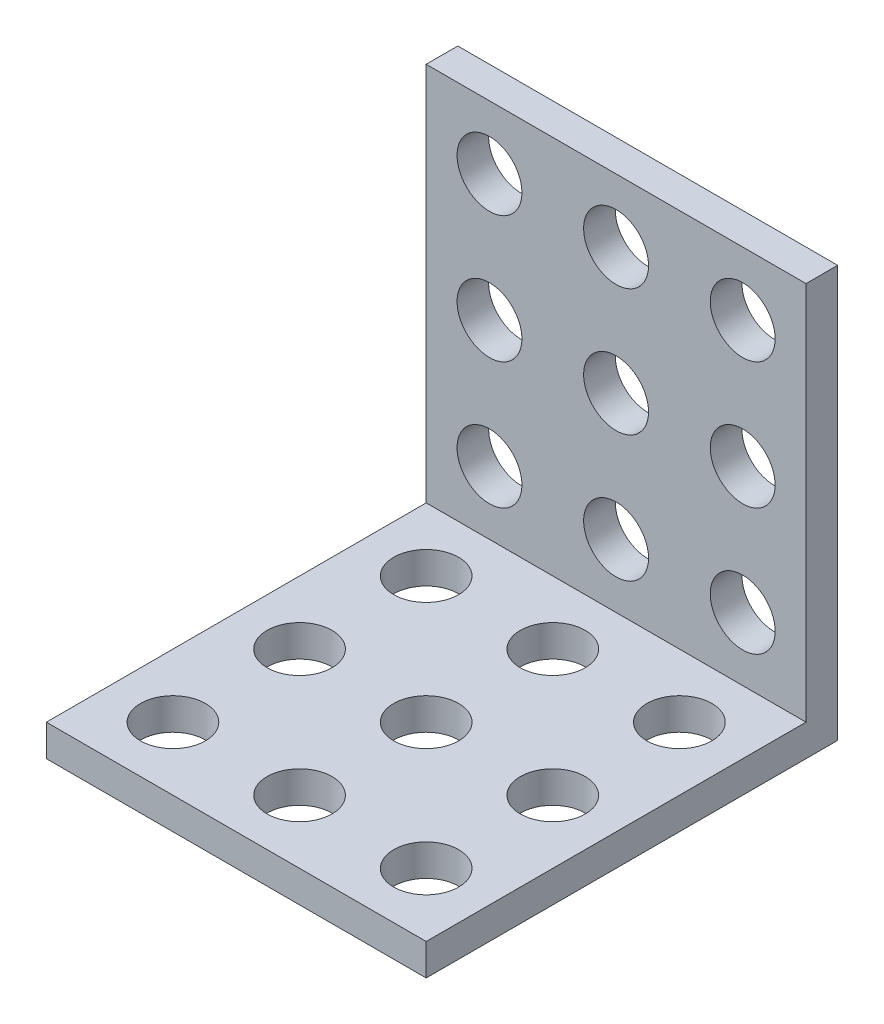
ISO-10303-21;
HEADER;
FILE_DESCRIPTION(('STEP AP214'),'2;1');
FILE_NAME('part.step','',(''),(''),'','','');
FILE_SCHEMA(('AUTOMOTIVE_DESIGN { 1 0 10303 214 1 1 1 1 }'));
ENDSEC;
DATA;
#1=APPLICATION_CONTEXT('core data for automotive mechanical design processes');
#2=APPLICATION_PROTOCOL_DEFINITION('international standard','automotive_design',2000,#1);
#3=PRODUCT_CONTEXT('',#1,'mechanical');
#4=PRODUCT('Part','Part','',(#3));
#5=PRODUCT_RELATED_PRODUCT_CATEGORY('part','',(#4));
#6=PRODUCT_DEFINITION_FORMATION('','',#4);
#7=PRODUCT_DEFINITION_CONTEXT('part definition',#1,'design');
#8=PRODUCT_DEFINITION('design','',#6,#7);
#9=PRODUCT_DEFINITION_SHAPE('','',#8);
#10=(LENGTH_UNIT() NAMED_UNIT(*) SI_UNIT(.MILLI.,.METRE.));
#11=(NAMED_UNIT(*) PLANE_ANGLE_UNIT() SI_UNIT($,.RADIAN.));
#12=(NAMED_UNIT(*) SI_UNIT($,.STERADIAN.) SOLID_ANGLE_UNIT());
#13=UNCERTAINTY_MEASURE_WITH_UNIT(LENGTH_MEASURE(1.E-05),#10,'distance_accuracy_value','');
#14=(GEOMETRIC_REPRESENTATION_CONTEXT(3) GLOBAL_UNCERTAINTY_ASSIGNED_CONTEXT((#13)) GLOBAL_UNIT_ASSIGNED_CONTEXT((#10,
#11,#12)) REPRESENTATION_CONTEXT('',''));
#15=CARTESIAN_POINT('',(0.,0.,0.));
#16=DIRECTION('',(0.,0.,1.));
#17=DIRECTION('',(1.,0.,0.));
#18=AXIS2_PLACEMENT_3D('',#15,#16,#17);
#19=CARTESIAN_POINT('',(24.,2.,26.));
#20=DIRECTION('',(0.,-1.,0.));
#21=DIRECTION('',(0.,0.,-1.));
#22=AXIS2_PLACEMENT_3D('',#19,#20,#21);
#23=PLANE('',#22);
#24=CARTESIAN_POINT('',(20.,1.99999999999999,6.));
#25=DIRECTION('',(0.,1.,0.));
#26=DIRECTION('',(0.,0.,1.));
#27=AXIS2_PLACEMENT_3D('',#24,#25,#26);
#28=CIRCLE('',#27,2.04999999999999);
#29=CARTESIAN_POINT('',(20.,1.99999999999999,8.04999999999999));
#30=VERTEX_POINT('',#29);
#31=EDGE_CURVE('E265',#30,#30,#28,.T.);
#32=ORIENTED_EDGE('',*,*,#31,.F.);
#33=EDGE_LOOP('',(#32));
#34=FACE_BOUND('',#33,.T.);
#35=CARTESIAN_POINT('',(20.,1.99999999999998,22.));
#36=DIRECTION('',(0.,1.,0.));
#37=DIRECTION('',(0.,0.,1.));
#38=AXIS2_PLACEMENT_3D('',#35,#36,#37);
#39=CIRCLE('',#38,2.04999999999999);
#40=CARTESIAN_POINT('',(20.,1.99999999999997,24.05));
#41=VERTEX_POINT('',#40);
#42=EDGE_CURVE('E275',#41,#41,#39,.T.);
#43=ORIENTED_EDGE('',*,*,#42,.F.);
#44=EDGE_LOOP('',(#43));
#45=FACE_BOUND('',#44,.T.);
#46=CARTESIAN_POINT('',(12.,1.99999999999999,14.));
#47=DIRECTION('',(0.,1.,0.));
#48=DIRECTION('',(0.,0.,1.));
#49=AXIS2_PLACEMENT_3D('',#46,#47,#48);
#50=CIRCLE('',#49,2.04999999999999);
#51=CARTESIAN_POINT('',(12.,1.99999999999998,16.05));
#52=VERTEX_POINT('',#51);
#53=EDGE_CURVE('E287',#52,#52,#50,.T.);
#54=ORIENTED_EDGE('',*,*,#53,.F.);
#55=EDGE_LOOP('',(#54));
#56=FACE_BOUND('',#55,.T.);
#57=CARTESIAN_POINT('',(12.,1.99999999999998,22.));
#58=DIRECTION('',(0.,1.,0.));
#59=DIRECTION('',(0.,0.,1.));
#60=AXIS2_PLACEMENT_3D('',#57,#58,#59);
#61=CIRCLE('',#60,2.04999999999999);
#62=CARTESIAN_POINT('',(12.,1.99999999999997,24.05));
#63=VERTEX_POINT('',#62);
#64=EDGE_CURVE('E293',#63,#63,#61,.T.);
#65=ORIENTED_EDGE('',*,*,#64,.F.);
#66=EDGE_LOOP('',(#65));
#67=FACE_BOUND('',#66,.T.);
#68=CARTESIAN_POINT('',(4.,1.99999999999999,6.));
#69=DIRECTION('',(0.,1.,0.));
#70=DIRECTION('',(0.,0.,1.));
#71=AXIS2_PLACEMENT_3D('',#68,#69,#70);
#72=CIRCLE('',#71,2.04999999999999);
#73=CARTESIAN_POINT('',(4.,1.99999999999999,8.04999999999999));
#74=VERTEX_POINT('',#73);
#75=EDGE_CURVE('E299',#74,#74,#72,.T.);
#76=ORIENTED_EDGE('',*,*,#75,.F.);
#77=EDGE_LOOP('',(#76));
#78=FACE_BOUND('',#77,.T.);
#79=CARTESIAN_POINT('',(4.,1.99999999999999,14.));
#80=DIRECTION('',(0.,1.,0.));
#81=DIRECTION('',(0.,0.,1.));
#82=AXIS2_PLACEMENT_3D('',#79,#80,#81);
#83=CIRCLE('',#82,2.04999999999999);
#84=CARTESIAN_POINT('',(4.,1.99999999999998,16.05));
#85=VERTEX_POINT('',#84);
#86=EDGE_CURVE('E305',#85,#85,#83,.T.);
#87=ORIENTED_EDGE('',*,*,#86,.F.);
#88=EDGE_LOOP('',(#87));
#89=FACE_BOUND('',#88,.T.);
#90=CARTESIAN_POINT('',(4.,1.99999999999998,22.));
#91=DIRECTION('',(0.,1.,0.));
#92=DIRECTION('',(0.,0.,1.));
#93=AXIS2_PLACEMENT_3D('',#90,#91,#92);
#94=CIRCLE('',#93,2.04999999999999);
#95=CARTESIAN_POINT('',(4.,1.99999999999997,24.05));
#96=VERTEX_POINT('',#95);
#97=EDGE_CURVE('E311',#96,#96,#94,.T.);
#98=ORIENTED_EDGE('',*,*,#97,.F.);
#99=EDGE_LOOP('',(#98));
#100=FACE_BOUND('',#99,.T.);
#101=DIRECTION('',(0.,0.,1.));
#102=VECTOR('',#101,1.);
#103=CARTESIAN_POINT('',(0.,2.,26.));
#104=LINE('',#103,#102);
#105=CARTESIAN_POINT('',(0.,2.,2.));
#106=VERTEX_POINT('',#105);
#107=CARTESIAN_POINT('',(0.,2.,26.));
#108=VERTEX_POINT('',#107);
#109=EDGE_CURVE('E72',#106,#108,#104,.T.);
#110=ORIENTED_EDGE('',*,*,#109,.T.);
#111=DIRECTION('',(-1.,0.,0.));
#112=VECTOR('',#111,1.);
#113=CARTESIAN_POINT('',(24.,2.,26.));
#114=LINE('',#113,#112);
#115=CARTESIAN_POINT('',(24.,2.,26.));
#116=VERTEX_POINT('',#115);
#117=EDGE_CURVE('E111',#116,#108,#114,.T.);
#118=ORIENTED_EDGE('',*,*,#117,.F.);
#119=DIRECTION('',(0.,0.,1.));
#120=VECTOR('',#119,1.);
#121=CARTESIAN_POINT('',(24.,2.,26.));
#122=LINE('',#121,#120);
#123=CARTESIAN_POINT('',(24.,2.,2.));
#124=VERTEX_POINT('',#123);
#125=EDGE_CURVE('E98',#124,#116,#122,.T.);
#126=ORIENTED_EDGE('',*,*,#125,.F.);
#127=DIRECTION('',(-1.,0.,0.));
#128=VECTOR('',#127,1.);
#129=CARTESIAN_POINT('',(24.,2.,2.));
#130=LINE('',#129,#128);
#131=EDGE_CURVE('E105',#124,#106,#130,.T.);
#132=ORIENTED_EDGE('',*,*,#131,.T.);
#133=EDGE_LOOP('',(#110,#118,#126,#132));
#134=FACE_BOUND('',#133,.T.);
#135=CARTESIAN_POINT('',(12.,1.99999999999999,6.));
#136=DIRECTION('',(0.,1.,0.));
#137=DIRECTION('',(0.,0.,1.));
#138=AXIS2_PLACEMENT_3D('',#135,#136,#137);
#139=CIRCLE('',#138,2.04999999999999);
#140=CARTESIAN_POINT('',(12.,1.99999999999999,8.04999999999999));
#141=VERTEX_POINT('',#140);
#142=EDGE_CURVE('E281',#141,#141,#139,.T.);
#143=ORIENTED_EDGE('',*,*,#142,.F.);
#144=EDGE_LOOP('',(#143));
#145=FACE_BOUND('',#144,.T.);
#146=CARTESIAN_POINT('',(20.,1.99999999999999,14.));
#147=DIRECTION('',(0.,1.,0.));
#148=DIRECTION('',(0.,0.,1.));
#149=AXIS2_PLACEMENT_3D('',#146,#147,#148);
#150=CIRCLE('',#149,2.04999999999999);
#151=CARTESIAN_POINT('',(20.,1.99999999999998,16.05));
#152=VERTEX_POINT('',#151);
#153=EDGE_CURVE('E267',#152,#152,#150,.T.);
#154=ORIENTED_EDGE('',*,*,#153,.F.);
#155=EDGE_LOOP('',(#154));
#156=FACE_BOUND('',#155,.T.);
#157=ADVANCED_FACE('F32',(#34,#45,#56,#67,#78,#89,#100,#134,#145,#156),#23,.F.);
#158=CARTESIAN_POINT('',(24.,0.,0.));
#159=DIRECTION('',(0.,1.,0.));
#160=DIRECTION('',(0.,0.,1.));
#161=AXIS2_PLACEMENT_3D('',#158,#159,#160);
#162=PLANE('',#161);
#163=CARTESIAN_POINT('',(20.,0.,6.));
#164=DIRECTION('',(0.,1.,0.));
#165=DIRECTION('',(0.,0.,1.));
#166=AXIS2_PLACEMENT_3D('',#163,#164,#165);
#167=CIRCLE('',#166,2.04999999999999);
#168=CARTESIAN_POINT('',(20.,0.,8.04999999999999));
#169=VERTEX_POINT('',#168);
#170=EDGE_CURVE('E263',#169,#169,#167,.T.);
#171=ORIENTED_EDGE('',*,*,#170,.T.);
#172=EDGE_LOOP('',(#171));
#173=FACE_BOUND('',#172,.T.);
#174=CARTESIAN_POINT('',(20.,0.,14.));
#175=DIRECTION('',(0.,1.,0.));
#176=DIRECTION('',(0.,0.,1.));
#177=AXIS2_PLACEMENT_3D('',#174,#175,#176);
#178=CIRCLE('',#177,2.04999999999999);
#179=CARTESIAN_POINT('',(20.,0.,16.05));
#180=VERTEX_POINT('',#179);
#181=EDGE_CURVE('E272',#180,#180,#178,.T.);
#182=ORIENTED_EDGE('',*,*,#181,.T.);
#183=EDGE_LOOP('',(#182));
#184=FACE_BOUND('',#183,.T.);
#185=CARTESIAN_POINT('',(20.,0.,22.));
#186=DIRECTION('',(0.,1.,0.));
#187=DIRECTION('',(0.,0.,1.));
#188=AXIS2_PLACEMENT_3D('',#185,#186,#187);
#189=CIRCLE('',#188,2.04999999999999);
#190=CARTESIAN_POINT('',(20.,0.,24.05));
#191=VERTEX_POINT('',#190);
#192=EDGE_CURVE('E278',#191,#191,#189,.T.);
#193=ORIENTED_EDGE('',*,*,#192,.T.);
#194=EDGE_LOOP('',(#193));
#195=FACE_BOUND('',#194,.T.);
#196=CARTESIAN_POINT('',(12.,0.,6.));
#197=DIRECTION('',(0.,1.,0.));
#198=DIRECTION('',(0.,0.,1.));
#199=AXIS2_PLACEMENT_3D('',#196,#197,#198);
#200=CIRCLE('',#199,2.04999999999999);
#201=CARTESIAN_POINT('',(12.,0.,8.04999999999999));
#202=VERTEX_POINT('',#201);
#203=EDGE_CURVE('E284',#202,#202,#200,.T.);
#204=ORIENTED_EDGE('',*,*,#203,.T.);
#205=EDGE_LOOP('',(#204));
#206=FACE_BOUND('',#205,.T.);
#207=CARTESIAN_POINT('',(12.,0.,14.));
#208=DIRECTION('',(0.,1.,0.));
#209=DIRECTION('',(0.,0.,1.));
#210=AXIS2_PLACEMENT_3D('',#207,#208,#209);
#211=CIRCLE('',#210,2.04999999999999);
#212=CARTESIAN_POINT('',(12.,0.,16.05));
#213=VERTEX_POINT('',#212);
#214=EDGE_CURVE('E290',#213,#213,#211,.T.);
#215=ORIENTED_EDGE('',*,*,#214,.T.);
#216=EDGE_LOOP('',(#215));
#217=FACE_BOUND('',#216,.T.);
#218=CARTESIAN_POINT('',(12.,0.,22.));
#219=DIRECTION('',(0.,1.,0.));
#220=DIRECTION('',(0.,0.,1.));
#221=AXIS2_PLACEMENT_3D('',#218,#219,#220);
#222=CIRCLE('',#221,2.04999999999999);
#223=CARTESIAN_POINT('',(12.,0.,24.05));
#224=VERTEX_POINT('',#223);
#225=EDGE_CURVE('E296',#224,#224,#222,.T.);
#226=ORIENTED_EDGE('',*,*,#225,.T.);
#227=EDGE_LOOP('',(#226));
#228=FACE_BOUND('',#227,.T.);
#229=CARTESIAN_POINT('',(4.,0.,6.));
#230=DIRECTION('',(0.,1.,0.));
#231=DIRECTION('',(0.,0.,1.));
#232=AXIS2_PLACEMENT_3D('',#229,#230,#231);
#233=CIRCLE('',#232,2.04999999999999);
#234=CARTESIAN_POINT('',(4.,0.,8.04999999999999));
#235=VERTEX_POINT('',#234);
#236=EDGE_CURVE('E302',#235,#235,#233,.T.);
#237=ORIENTED_EDGE('',*,*,#236,.T.);
#238=EDGE_LOOP('',(#237));
#239=FACE_BOUND('',#238,.T.);
#240=CARTESIAN_POINT('',(4.,0.,14.));
#241=DIRECTION('',(0.,1.,0.));
#242=DIRECTION('',(0.,0.,1.));
#243=AXIS2_PLACEMENT_3D('',#240,#241,#242);
#244=CIRCLE('',#243,2.04999999999999);
#245=CARTESIAN_POINT('',(4.,0.,16.05));
#246=VERTEX_POINT('',#245);
#247=EDGE_CURVE('E308',#246,#246,#244,.T.);
#248=ORIENTED_EDGE('',*,*,#247,.T.);
#249=EDGE_LOOP('',(#248));
#250=FACE_BOUND('',#249,.T.);
#251=CARTESIAN_POINT('',(4.,0.,22.));
#252=DIRECTION('',(0.,1.,0.));
#253=DIRECTION('',(0.,0.,1.));
#254=AXIS2_PLACEMENT_3D('',#251,#252,#253);
#255=CIRCLE('',#254,2.04999999999999);
#256=CARTESIAN_POINT('',(4.,0.,24.05));
#257=VERTEX_POINT('',#256);
#258=EDGE_CURVE('E314',#257,#257,#255,.T.);
#259=ORIENTED_EDGE('',*,*,#258,.T.);
#260=EDGE_LOOP('',(#259));
#261=FACE_BOUND('',#260,.T.);
#262=DIRECTION('',(0.,0.,-1.));
#263=VECTOR('',#262,1.);
#264=CARTESIAN_POINT('',(0.,0.,0.));
#265=LINE('',#264,#263);
#266=CARTESIAN_POINT('',(0.,0.,26.));
#267=VERTEX_POINT('',#266);
#268=CARTESIAN_POINT('',(0.,0.,0.));
#269=VERTEX_POINT('',#268);
#270=EDGE_CURVE('E119',#267,#269,#265,.T.);
#271=ORIENTED_EDGE('',*,*,#270,.T.);
#272=DIRECTION('',(-1.,0.,0.));
#273=VECTOR('',#272,1.);
#274=CARTESIAN_POINT('',(24.,0.,0.));
#275=LINE('',#274,#273);
#276=CARTESIAN_POINT('',(24.,0.,0.));
#277=VERTEX_POINT('',#276);
#278=EDGE_CURVE('E137',#277,#269,#275,.T.);
#279=ORIENTED_EDGE('',*,*,#278,.F.);
#280=DIRECTION('',(0.,0.,-1.));
#281=VECTOR('',#280,1.);
#282=CARTESIAN_POINT('',(24.,0.,0.));
#283=LINE('',#282,#281);
#284=CARTESIAN_POINT('',(24.,0.,26.));
#285=VERTEX_POINT('',#284);
#286=EDGE_CURVE('E130',#285,#277,#283,.T.);
#287=ORIENTED_EDGE('',*,*,#286,.F.);
#288=DIRECTION('',(-1.,0.,0.));
#289=VECTOR('',#288,1.);
#290=CARTESIAN_POINT('',(24.,0.,26.));
#291=LINE('',#290,#289);
#292=EDGE_CURVE('E115',#285,#267,#291,.T.);
#293=ORIENTED_EDGE('',*,*,#292,.T.);
#294=EDGE_LOOP('',(#271,#279,#287,#293));
#295=FACE_BOUND('',#294,.T.);
#296=ADVANCED_FACE('F195',(#173,#184,#195,#206,#217,#228,#239,#250,#261,#295),#162,.F.);
#297=CARTESIAN_POINT('',(24.,0.,0.));
#298=DIRECTION('',(0.,0.,1.));
#299=DIRECTION('',(1.,0.,0.));
#300=AXIS2_PLACEMENT_3D('',#297,#298,#299);
#301=PLANE('',#300);
#302=CARTESIAN_POINT('',(12.,22.,0.));
#303=DIRECTION('',(0.,0.,1.));
#304=DIRECTION('',(1.,0.,0.));
#305=AXIS2_PLACEMENT_3D('',#302,#303,#304);
#306=CIRCLE('',#305,2.04999999999999);
#307=CARTESIAN_POINT('',(14.05,22.,0.));
#308=VERTEX_POINT('',#307);
#309=EDGE_CURVE('E317',#308,#308,#306,.T.);
#310=ORIENTED_EDGE('',*,*,#309,.T.);
#311=EDGE_LOOP('',(#310));
#312=FACE_BOUND('',#311,.T.);
#313=CARTESIAN_POINT('',(12.,14.,0.));
#314=DIRECTION('',(0.,0.,1.));
#315=DIRECTION('',(1.,0.,0.));
#316=AXIS2_PLACEMENT_3D('',#313,#314,#315);
#317=CIRCLE('',#316,2.04999999999999);
#318=CARTESIAN_POINT('',(14.05,14.,0.));
#319=VERTEX_POINT('',#318);
#320=EDGE_CURVE('E323',#319,#319,#317,.T.);
#321=ORIENTED_EDGE('',*,*,#320,.T.);
#322=EDGE_LOOP('',(#321));
#323=FACE_BOUND('',#322,.T.);
#324=CARTESIAN_POINT('',(4.,22.,0.));
#325=DIRECTION('',(0.,0.,1.));
#326=DIRECTION('',(1.,0.,0.));
#327=AXIS2_PLACEMENT_3D('',#324,#325,#326);
#328=CIRCLE('',#327,2.04999999999999);
#329=CARTESIAN_POINT('',(6.04999999999999,22.,0.));
#330=VERTEX_POINT('',#329);
#331=EDGE_CURVE('E123',#330,#330,#328,.T.);
#332=ORIENTED_EDGE('',*,*,#331,.T.);
#333=EDGE_LOOP('',(#332));
#334=FACE_BOUND('',#333,.T.);
#335=DIRECTION('',(0.,1.,0.));
#336=VECTOR('',#335,1.);
#337=CARTESIAN_POINT('',(0.,0.,0.));
#338=LINE('',#337,#336);
#339=CARTESIAN_POINT('',(0.,26.,0.));
#340=VERTEX_POINT('',#339);
#341=EDGE_CURVE('E122',#269,#340,#338,.T.);
#342=ORIENTED_EDGE('',*,*,#341,.T.);
#343=DIRECTION('',(-1.,0.,0.));
#344=VECTOR('',#343,1.);
#345=CARTESIAN_POINT('',(24.,26.,0.));
#346=LINE('',#345,#344);
#347=CARTESIAN_POINT('',(24.,26.,0.));
#348=VERTEX_POINT('',#347);
#349=EDGE_CURVE('E134',#348,#340,#346,.T.);
#350=ORIENTED_EDGE('',*,*,#349,.F.);
#351=DIRECTION('',(0.,1.,0.));
#352=VECTOR('',#351,1.);
#353=CARTESIAN_POINT('',(24.,0.,0.));
#354=LINE('',#353,#352);
#355=EDGE_CURVE('E87',#277,#348,#354,.T.);
#356=ORIENTED_EDGE('',*,*,#355,.F.);
#357=ORIENTED_EDGE('',*,*,#278,.T.);
#358=EDGE_LOOP('',(#342,#350,#356,#357));
#359=FACE_BOUND('',#358,.T.);
#360=CARTESIAN_POINT('',(20.,22.,0.));
#361=DIRECTION('',(0.,0.,1.));
#362=DIRECTION('',(1.,0.,0.));
#363=AXIS2_PLACEMENT_3D('',#360,#361,#362);
#364=CIRCLE('',#363,2.04999999999999);
#365=CARTESIAN_POINT('',(22.05,22.,0.));
#366=VERTEX_POINT('',#365);
#367=EDGE_CURVE('E139',#366,#366,#364,.T.);
#368=ORIENTED_EDGE('',*,*,#367,.T.);
#369=EDGE_LOOP('',(#368));
#370=FACE_BOUND('',#369,.T.);
#371=CARTESIAN_POINT('',(4.,14.,0.));
#372=DIRECTION('',(0.,0.,1.));
#373=DIRECTION('',(1.,0.,0.));
#374=AXIS2_PLACEMENT_3D('',#371,#372,#373);
#375=CIRCLE('',#374,2.04999999999999);
#376=CARTESIAN_POINT('',(6.04999999999999,14.,0.));
#377=VERTEX_POINT('',#376);
#378=EDGE_CURVE('E145',#377,#377,#375,.T.);
#379=ORIENTED_EDGE('',*,*,#378,.T.);
#380=EDGE_LOOP('',(#379));
#381=FACE_BOUND('',#380,.T.);
#382=CARTESIAN_POINT('',(20.,14.,0.));
#383=DIRECTION('',(0.,0.,1.));
#384=DIRECTION('',(1.,0.,0.));
#385=AXIS2_PLACEMENT_3D('',#382,#383,#384);
#386=CIRCLE('',#385,2.04999999999999);
#387=CARTESIAN_POINT('',(22.05,14.,0.));
#388=VERTEX_POINT('',#387);
#389=EDGE_CURVE('E151',#388,#388,#386,.T.);
#390=ORIENTED_EDGE('',*,*,#389,.T.);
#391=EDGE_LOOP('',(#390));
#392=FACE_BOUND('',#391,.T.);
#393=CARTESIAN_POINT('',(4.,6.,0.));
#394=DIRECTION('',(0.,0.,1.));
#395=DIRECTION('',(1.,0.,0.));
#396=AXIS2_PLACEMENT_3D('',#393,#394,#395);
#397=CIRCLE('',#396,2.04999999999999);
#398=CARTESIAN_POINT('',(6.04999999999999,6.,0.));
#399=VERTEX_POINT('',#398);
#400=EDGE_CURVE('E157',#399,#399,#397,.T.);
#401=ORIENTED_EDGE('',*,*,#400,.T.);
#402=EDGE_LOOP('',(#401));
#403=FACE_BOUND('',#402,.T.);
#404=CARTESIAN_POINT('',(12.,6.,0.));
#405=DIRECTION('',(0.,0.,1.));
#406=DIRECTION('',(1.,0.,0.));
#407=AXIS2_PLACEMENT_3D('',#404,#405,#406);
#408=CIRCLE('',#407,2.04999999999999);
#409=CARTESIAN_POINT('',(14.05,6.,0.));
#410=VERTEX_POINT('',#409);
#411=EDGE_CURVE('E163',#410,#410,#408,.T.);
#412=ORIENTED_EDGE('',*,*,#411,.T.);
#413=EDGE_LOOP('',(#412));
#414=FACE_BOUND('',#413,.T.);
#415=CARTESIAN_POINT('',(20.,6.,0.));
#416=DIRECTION('',(0.,0.,1.));
#417=DIRECTION('',(1.,0.,0.));
#418=AXIS2_PLACEMENT_3D('',#415,#416,#417);
#419=CIRCLE('',#418,2.04999999999999);
#420=CARTESIAN_POINT('',(22.05,6.,0.));
#421=VERTEX_POINT('',#420);
#422=EDGE_CURVE('E41',#421,#421,#419,.T.);
#423=ORIENTED_EDGE('',*,*,#422,.T.);
#424=EDGE_LOOP('',(#423));
#425=FACE_BOUND('',#424,.T.);
#426=ADVANCED_FACE('F171',(#312,#323,#334,#359,#370,#381,#392,#403,#414,#425),#301,.F.);
#427=CARTESIAN_POINT('',(24.,26.,0.));
#428=DIRECTION('',(0.,-1.,0.));
#429=DIRECTION('',(0.,0.,-1.));
#430=AXIS2_PLACEMENT_3D('',#427,#428,#429);
#431=PLANE('',#430);
#432=DIRECTION('',(0.,0.,1.));
#433=VECTOR('',#432,1.);
#434=CARTESIAN_POINT('',(0.,26.,0.));
#435=LINE('',#434,#433);
#436=CARTESIAN_POINT('',(0.,26.,2.));
#437=VERTEX_POINT('',#436);
#438=EDGE_CURVE('E125',#340,#437,#435,.T.);
#439=ORIENTED_EDGE('',*,*,#438,.T.);
#440=DIRECTION('',(-1.,0.,0.));
#441=VECTOR('',#440,1.);
#442=CARTESIAN_POINT('',(24.,26.,2.));
#443=LINE('',#442,#441);
#444=CARTESIAN_POINT('',(24.,26.,2.));
#445=VERTEX_POINT('',#444);
#446=EDGE_CURVE('E110',#445,#437,#443,.T.);
#447=ORIENTED_EDGE('',*,*,#446,.F.);
#448=DIRECTION('',(0.,0.,1.));
#449=VECTOR('',#448,1.);
#450=CARTESIAN_POINT('',(24.,26.,0.));
#451=LINE('',#450,#449);
#452=EDGE_CURVE('E100',#348,#445,#451,.T.);
#453=ORIENTED_EDGE('',*,*,#452,.F.);
#454=ORIENTED_EDGE('',*,*,#349,.T.);
#455=EDGE_LOOP('',(#439,#447,#453,#454));
#456=FACE_BOUND('',#455,.T.);
#457=ADVANCED_FACE('F181',(#456),#431,.F.);
#458=CARTESIAN_POINT('',(24.,2.,2.));
#459=DIRECTION('',(0.,0.,-1.));
#460=DIRECTION('',(-1.,0.,0.));
#461=AXIS2_PLACEMENT_3D('',#458,#459,#460);
#462=PLANE('',#461);
#463=CARTESIAN_POINT('',(12.,22.,2.));
#464=DIRECTION('',(0.,0.,1.));
#465=DIRECTION('',(1.,0.,0.));
#466=AXIS2_PLACEMENT_3D('',#463,#464,#465);
#467=CIRCLE('',#466,2.04999999999999);
#468=CARTESIAN_POINT('',(14.05,22.,2.));
#469=VERTEX_POINT('',#468);
#470=EDGE_CURVE('E320',#469,#469,#467,.T.);
#471=ORIENTED_EDGE('',*,*,#470,.F.);
#472=EDGE_LOOP('',(#471));
#473=FACE_BOUND('',#472,.T.);
#474=CARTESIAN_POINT('',(12.,14.,2.));
#475=DIRECTION('',(0.,0.,1.));
#476=DIRECTION('',(1.,0.,0.));
#477=AXIS2_PLACEMENT_3D('',#474,#475,#476);
#478=CIRCLE('',#477,2.04999999999999);
#479=CARTESIAN_POINT('',(14.05,14.,2.));
#480=VERTEX_POINT('',#479);
#481=EDGE_CURVE('E326',#480,#480,#478,.T.);
#482=ORIENTED_EDGE('',*,*,#481,.F.);
#483=EDGE_LOOP('',(#482));
#484=FACE_BOUND('',#483,.T.);
#485=CARTESIAN_POINT('',(4.,22.,2.));
#486=DIRECTION('',(0.,0.,1.));
#487=DIRECTION('',(1.,0.,0.));
#488=AXIS2_PLACEMENT_3D('',#485,#486,#487);
#489=CIRCLE('',#488,2.04999999999999);
#490=CARTESIAN_POINT('',(6.04999999999999,22.,2.));
#491=VERTEX_POINT('',#490);
#492=EDGE_CURVE('E329',#491,#491,#489,.T.);
#493=ORIENTED_EDGE('',*,*,#492,.F.);
#494=EDGE_LOOP('',(#493));
#495=FACE_BOUND('',#494,.T.);
#496=DIRECTION('',(0.,-1.,0.));
#497=VECTOR('',#496,1.);
#498=CARTESIAN_POINT('',(0.,2.,2.));
#499=LINE('',#498,#497);
#500=EDGE_CURVE('E109',#437,#106,#499,.T.);
#501=ORIENTED_EDGE('',*,*,#500,.T.);
#502=ORIENTED_EDGE('',*,*,#131,.F.);
#503=DIRECTION('',(0.,-1.,0.));
#504=VECTOR('',#503,1.);
#505=CARTESIAN_POINT('',(24.,2.,2.));
#506=LINE('',#505,#504);
#507=EDGE_CURVE('E94',#445,#124,#506,.T.);
#508=ORIENTED_EDGE('',*,*,#507,.F.);
#509=ORIENTED_EDGE('',*,*,#446,.T.);
#510=EDGE_LOOP('',(#501,#502,#508,#509));
#511=FACE_BOUND('',#510,.T.);
#512=CARTESIAN_POINT('',(20.,22.,2.));
#513=DIRECTION('',(0.,0.,1.));
#514=DIRECTION('',(1.,0.,0.));
#515=AXIS2_PLACEMENT_3D('',#512,#513,#514);
#516=CIRCLE('',#515,2.04999999999999);
#517=CARTESIAN_POINT('',(22.05,22.,2.));
#518=VERTEX_POINT('',#517);
#519=EDGE_CURVE('E142',#518,#518,#516,.T.);
#520=ORIENTED_EDGE('',*,*,#519,.F.);
#521=EDGE_LOOP('',(#520));
#522=FACE_BOUND('',#521,.T.);
#523=CARTESIAN_POINT('',(4.,14.,2.));
#524=DIRECTION('',(0.,0.,1.));
#525=DIRECTION('',(1.,0.,0.));
#526=AXIS2_PLACEMENT_3D('',#523,#524,#525);
#527=CIRCLE('',#526,2.04999999999999);
#528=CARTESIAN_POINT('',(6.04999999999999,14.,2.));
#529=VERTEX_POINT('',#528);
#530=EDGE_CURVE('E148',#529,#529,#527,.T.);
#531=ORIENTED_EDGE('',*,*,#530,.F.);
#532=EDGE_LOOP('',(#531));
#533=FACE_BOUND('',#532,.T.);
#534=CARTESIAN_POINT('',(20.,14.,2.));
#535=DIRECTION('',(0.,0.,1.));
#536=DIRECTION('',(1.,0.,0.));
#537=AXIS2_PLACEMENT_3D('',#534,#535,#536);
#538=CIRCLE('',#537,2.04999999999999);
#539=CARTESIAN_POINT('',(22.05,14.,2.));
#540=VERTEX_POINT('',#539);
#541=EDGE_CURVE('E154',#540,#540,#538,.T.);
#542=ORIENTED_EDGE('',*,*,#541,.F.);
#543=EDGE_LOOP('',(#542));
#544=FACE_BOUND('',#543,.T.);
#545=CARTESIAN_POINT('',(4.,6.,2.));
#546=DIRECTION('',(0.,0.,1.));
#547=DIRECTION('',(1.,0.,0.));
#548=AXIS2_PLACEMENT_3D('',#545,#546,#547);
#549=CIRCLE('',#548,2.04999999999999);
#550=CARTESIAN_POINT('',(6.04999999999999,6.,2.));
#551=VERTEX_POINT('',#550);
#552=EDGE_CURVE('E160',#551,#551,#549,.T.);
#553=ORIENTED_EDGE('',*,*,#552,.F.);
#554=EDGE_LOOP('',(#553));
#555=FACE_BOUND('',#554,.T.);
#556=CARTESIAN_POINT('',(12.,6.,2.));
#557=DIRECTION('',(0.,0.,1.));
#558=DIRECTION('',(1.,0.,0.));
#559=AXIS2_PLACEMENT_3D('',#556,#557,#558);
#560=CIRCLE('',#559,2.04999999999999);
#561=CARTESIAN_POINT('',(14.05,6.,2.));
#562=VERTEX_POINT('',#561);
#563=EDGE_CURVE('E166',#562,#562,#560,.T.);
#564=ORIENTED_EDGE('',*,*,#563,.F.);
#565=EDGE_LOOP('',(#564));
#566=FACE_BOUND('',#565,.T.);
#567=CARTESIAN_POINT('',(20.,6.,2.));
#568=DIRECTION('',(0.,0.,1.));
#569=DIRECTION('',(1.,0.,0.));
#570=AXIS2_PLACEMENT_3D('',#567,#568,#569);
#571=CIRCLE('',#570,2.04999999999999);
#572=CARTESIAN_POINT('',(22.05,6.,2.));
#573=VERTEX_POINT('',#572);
#574=EDGE_CURVE('E11',#573,#573,#571,.T.);
#575=ORIENTED_EDGE('',*,*,#574,.F.);
#576=EDGE_LOOP('',(#575));
#577=FACE_BOUND('',#576,.T.);
#578=ADVANCED_FACE('F106',(#473,#484,#495,#511,#522,#533,#544,#555,#566,#577),#462,.F.);
#579=CARTESIAN_POINT('',(24.,0.,26.));
#580=DIRECTION('',(0.,0.,-1.));
#581=DIRECTION('',(-1.,0.,0.));
#582=AXIS2_PLACEMENT_3D('',#579,#580,#581);
#583=PLANE('',#582);
#584=DIRECTION('',(0.,-1.,0.));
#585=VECTOR('',#584,1.);
#586=CARTESIAN_POINT('',(0.,0.,26.));
#587=LINE('',#586,#585);
#588=EDGE_CURVE('E78',#108,#267,#587,.T.);
#589=ORIENTED_EDGE('',*,*,#588,.T.);
#590=ORIENTED_EDGE('',*,*,#292,.F.);
#591=DIRECTION('',(0.,-1.,0.));
#592=VECTOR('',#591,1.);
#593=CARTESIAN_POINT('',(24.,0.,26.));
#594=LINE('',#593,#592);
#595=EDGE_CURVE('E49',#116,#285,#594,.T.);
#596=ORIENTED_EDGE('',*,*,#595,.F.);
#597=ORIENTED_EDGE('',*,*,#117,.T.);
#598=EDGE_LOOP('',(#589,#590,#596,#597));
#599=FACE_BOUND('',#598,.T.);
#600=ADVANCED_FACE('F180',(#599),#583,.F.);
#601=CARTESIAN_POINT('',(24.,0.,0.));
#602=DIRECTION('',(-1.,0.,0.));
#603=DIRECTION('',(0.,0.,1.));
#604=AXIS2_PLACEMENT_3D('',#601,#602,#603);
#605=PLANE('',#604);
#606=ORIENTED_EDGE('',*,*,#286,.T.);
#607=ORIENTED_EDGE('',*,*,#355,.T.);
#608=ORIENTED_EDGE('',*,*,#452,.T.);
#609=ORIENTED_EDGE('',*,*,#507,.T.);
#610=ORIENTED_EDGE('',*,*,#125,.T.);
#611=ORIENTED_EDGE('',*,*,#595,.T.);
#612=EDGE_LOOP('',(#606,#607,#608,#609,#610,#611));
#613=FACE_BOUND('',#612,.T.);
#614=ADVANCED_FACE('F96',(#613),#605,.F.);
#615=CARTESIAN_POINT('',(0.,0.,0.));
#616=DIRECTION('',(-1.,0.,0.));
#617=DIRECTION('',(0.,0.,1.));
#618=AXIS2_PLACEMENT_3D('',#615,#616,#617);
#619=PLANE('',#618);
#620=ORIENTED_EDGE('',*,*,#270,.F.);
#621=ORIENTED_EDGE('',*,*,#588,.F.);
#622=ORIENTED_EDGE('',*,*,#109,.F.);
#623=ORIENTED_EDGE('',*,*,#500,.F.);
#624=ORIENTED_EDGE('',*,*,#438,.F.);
#625=ORIENTED_EDGE('',*,*,#341,.F.);
#626=EDGE_LOOP('',(#620,#621,#622,#623,#624,#625));
#627=FACE_BOUND('',#626,.T.);
#628=ADVANCED_FACE('F205',(#627),#619,.T.);
#629=CARTESIAN_POINT('',(4.,22.,2.));
#630=DIRECTION('',(0.,0.,1.));
#631=DIRECTION('',(1.,0.,0.));
#632=AXIS2_PLACEMENT_3D('',#629,#630,#631);
#633=CYLINDRICAL_SURFACE('',#632,2.04999999999999);
#634=ORIENTED_EDGE('',*,*,#331,.F.);
#635=EDGE_LOOP('',(#634));
#636=FACE_BOUND('',#635,.T.);
#637=ORIENTED_EDGE('',*,*,#492,.T.);
#638=EDGE_LOOP('',(#637));
#639=FACE_BOUND('',#638,.T.);
#640=ADVANCED_FACE('F208',(#636,#639),#633,.F.);
#641=CARTESIAN_POINT('',(12.,14.,2.));
#642=DIRECTION('',(0.,0.,1.));
#643=DIRECTION('',(1.,0.,0.));
#644=AXIS2_PLACEMENT_3D('',#641,#642,#643);
#645=CYLINDRICAL_SURFACE('',#644,2.04999999999999);
#646=ORIENTED_EDGE('',*,*,#320,.F.);
#647=EDGE_LOOP('',(#646));
#648=FACE_BOUND('',#647,.T.);
#649=ORIENTED_EDGE('',*,*,#481,.T.);
#650=EDGE_LOOP('',(#649));
#651=FACE_BOUND('',#650,.T.);
#652=ADVANCED_FACE('F214',(#648,#651),#645,.F.);
#653=CARTESIAN_POINT('',(12.,22.,2.));
#654=DIRECTION('',(0.,0.,1.));
#655=DIRECTION('',(1.,0.,0.));
#656=AXIS2_PLACEMENT_3D('',#653,#654,#655);
#657=CYLINDRICAL_SURFACE('',#656,2.04999999999999);
#658=ORIENTED_EDGE('',*,*,#309,.F.);
#659=EDGE_LOOP('',(#658));
#660=FACE_BOUND('',#659,.T.);
#661=ORIENTED_EDGE('',*,*,#470,.T.);
#662=EDGE_LOOP('',(#661));
#663=FACE_BOUND('',#662,.T.);
#664=ADVANCED_FACE('F218',(#660,#663),#657,.F.);
#665=CARTESIAN_POINT('',(20.,22.,2.));
#666=DIRECTION('',(0.,0.,1.));
#667=DIRECTION('',(1.,0.,0.));
#668=AXIS2_PLACEMENT_3D('',#665,#666,#667);
#669=CYLINDRICAL_SURFACE('',#668,2.04999999999999);
#670=ORIENTED_EDGE('',*,*,#367,.F.);
#671=EDGE_LOOP('',(#670));
#672=FACE_BOUND('',#671,.T.);
#673=ORIENTED_EDGE('',*,*,#519,.T.);
#674=EDGE_LOOP('',(#673));
#675=FACE_BOUND('',#674,.T.);
#676=ADVANCED_FACE('F222',(#672,#675),#669,.F.);
#677=CARTESIAN_POINT('',(4.,14.,2.));
#678=DIRECTION('',(0.,0.,1.));
#679=DIRECTION('',(1.,0.,0.));
#680=AXIS2_PLACEMENT_3D('',#677,#678,#679);
#681=CYLINDRICAL_SURFACE('',#680,2.04999999999999);
#682=ORIENTED_EDGE('',*,*,#378,.F.);
#683=EDGE_LOOP('',(#682));
#684=FACE_BOUND('',#683,.T.);
#685=ORIENTED_EDGE('',*,*,#530,.T.);
#686=EDGE_LOOP('',(#685));
#687=FACE_BOUND('',#686,.T.);
#688=ADVANCED_FACE('F368',(#684,#687),#681,.F.);
#689=CARTESIAN_POINT('',(20.,14.,2.));
#690=DIRECTION('',(0.,0.,1.));
#691=DIRECTION('',(1.,0.,0.));
#692=AXIS2_PLACEMENT_3D('',#689,#690,#691);
#693=CYLINDRICAL_SURFACE('',#692,2.04999999999999);
#694=ORIENTED_EDGE('',*,*,#389,.F.);
#695=EDGE_LOOP('',(#694));
#696=FACE_BOUND('',#695,.T.);
#697=ORIENTED_EDGE('',*,*,#541,.T.);
#698=EDGE_LOOP('',(#697));
#699=FACE_BOUND('',#698,.T.);
#700=ADVANCED_FACE('F362',(#696,#699),#693,.F.);
#701=CARTESIAN_POINT('',(4.,6.,2.));
#702=DIRECTION('',(0.,0.,1.));
#703=DIRECTION('',(1.,0.,0.));
#704=AXIS2_PLACEMENT_3D('',#701,#702,#703);
#705=CYLINDRICAL_SURFACE('',#704,2.04999999999999);
#706=ORIENTED_EDGE('',*,*,#400,.F.);
#707=EDGE_LOOP('',(#706));
#708=FACE_BOUND('',#707,.T.);
#709=ORIENTED_EDGE('',*,*,#552,.T.);
#710=EDGE_LOOP('',(#709));
#711=FACE_BOUND('',#710,.T.);
#712=ADVANCED_FACE('F356',(#708,#711),#705,.F.);
#713=CARTESIAN_POINT('',(12.,6.,2.));
#714=DIRECTION('',(0.,0.,1.));
#715=DIRECTION('',(1.,0.,0.));
#716=AXIS2_PLACEMENT_3D('',#713,#714,#715);
#717=CYLINDRICAL_SURFACE('',#716,2.04999999999999);
#718=ORIENTED_EDGE('',*,*,#411,.F.);
#719=EDGE_LOOP('',(#718));
#720=FACE_BOUND('',#719,.T.);
#721=ORIENTED_EDGE('',*,*,#563,.T.);
#722=EDGE_LOOP('',(#721));
#723=FACE_BOUND('',#722,.T.);
#724=ADVANCED_FACE('F176',(#720,#723),#717,.F.);
#725=CARTESIAN_POINT('',(20.,6.,2.));
#726=DIRECTION('',(0.,0.,1.));
#727=DIRECTION('',(1.,0.,0.));
#728=AXIS2_PLACEMENT_3D('',#725,#726,#727);
#729=CYLINDRICAL_SURFACE('',#728,2.04999999999999);
#730=ORIENTED_EDGE('',*,*,#422,.F.);
#731=EDGE_LOOP('',(#730));
#732=FACE_BOUND('',#731,.T.);
#733=ORIENTED_EDGE('',*,*,#574,.T.);
#734=EDGE_LOOP('',(#733));
#735=FACE_BOUND('',#734,.T.);
#736=ADVANCED_FACE('F34',(#732,#735),#729,.F.);
#737=CARTESIAN_POINT('',(4.,1.99999999999998,22.));
#738=DIRECTION('',(0.,1.,0.));
#739=DIRECTION('',(0.,0.,1.));
#740=AXIS2_PLACEMENT_3D('',#737,#738,#739);
#741=CYLINDRICAL_SURFACE('',#740,2.04999999999999);
#742=ORIENTED_EDGE('',*,*,#258,.F.);
#743=EDGE_LOOP('',(#742));
#744=FACE_BOUND('',#743,.T.);
#745=ORIENTED_EDGE('',*,*,#97,.T.);
#746=EDGE_LOOP('',(#745));
#747=FACE_BOUND('',#746,.T.);
#748=ADVANCED_FACE('F175',(#744,#747),#741,.F.);
#749=CARTESIAN_POINT('',(4.,1.99999999999998,14.));
#750=DIRECTION('',(0.,1.,0.));
#751=DIRECTION('',(0.,0.,1.));
#752=AXIS2_PLACEMENT_3D('',#749,#750,#751);
#753=CYLINDRICAL_SURFACE('',#752,2.04999999999999);
#754=ORIENTED_EDGE('',*,*,#247,.F.);
#755=EDGE_LOOP('',(#754));
#756=FACE_BOUND('',#755,.T.);
#757=ORIENTED_EDGE('',*,*,#86,.T.);
#758=EDGE_LOOP('',(#757));
#759=FACE_BOUND('',#758,.T.);
#760=ADVANCED_FACE('F226',(#756,#759),#753,.F.);
#761=CARTESIAN_POINT('',(4.,1.99999999999999,6.));
#762=DIRECTION('',(0.,1.,0.));
#763=DIRECTION('',(0.,0.,1.));
#764=AXIS2_PLACEMENT_3D('',#761,#762,#763);
#765=CYLINDRICAL_SURFACE('',#764,2.04999999999999);
#766=ORIENTED_EDGE('',*,*,#236,.F.);
#767=EDGE_LOOP('',(#766));
#768=FACE_BOUND('',#767,.T.);
#769=ORIENTED_EDGE('',*,*,#75,.T.);
#770=EDGE_LOOP('',(#769));
#771=FACE_BOUND('',#770,.T.);
#772=ADVANCED_FACE('F230',(#768,#771),#765,.F.);
#773=CARTESIAN_POINT('',(12.,1.99999999999998,22.));
#774=DIRECTION('',(0.,1.,0.));
#775=DIRECTION('',(0.,0.,1.));
#776=AXIS2_PLACEMENT_3D('',#773,#774,#775);
#777=CYLINDRICAL_SURFACE('',#776,2.04999999999999);
#778=ORIENTED_EDGE('',*,*,#225,.F.);
#779=EDGE_LOOP('',(#778));
#780=FACE_BOUND('',#779,.T.);
#781=ORIENTED_EDGE('',*,*,#64,.T.);
#782=EDGE_LOOP('',(#781));
#783=FACE_BOUND('',#782,.T.);
#784=ADVANCED_FACE('F234',(#780,#783),#777,.F.);
#785=CARTESIAN_POINT('',(12.,1.99999999999998,14.));
#786=DIRECTION('',(0.,1.,0.));
#787=DIRECTION('',(0.,0.,1.));
#788=AXIS2_PLACEMENT_3D('',#785,#786,#787);
#789=CYLINDRICAL_SURFACE('',#788,2.04999999999999);
#790=ORIENTED_EDGE('',*,*,#214,.F.);
#791=EDGE_LOOP('',(#790));
#792=FACE_BOUND('',#791,.T.);
#793=ORIENTED_EDGE('',*,*,#53,.T.);
#794=EDGE_LOOP('',(#793));
#795=FACE_BOUND('',#794,.T.);
#796=ADVANCED_FACE('F238',(#792,#795),#789,.F.);
#797=CARTESIAN_POINT('',(12.,1.99999999999999,6.));
#798=DIRECTION('',(0.,1.,0.));
#799=DIRECTION('',(0.,0.,1.));
#800=AXIS2_PLACEMENT_3D('',#797,#798,#799);
#801=CYLINDRICAL_SURFACE('',#800,2.04999999999999);
#802=ORIENTED_EDGE('',*,*,#203,.F.);
#803=EDGE_LOOP('',(#802));
#804=FACE_BOUND('',#803,.T.);
#805=ORIENTED_EDGE('',*,*,#142,.T.);
#806=EDGE_LOOP('',(#805));
#807=FACE_BOUND('',#806,.T.);
#808=ADVANCED_FACE('F242',(#804,#807),#801,.F.);
#809=CARTESIAN_POINT('',(20.,1.99999999999998,22.));
#810=DIRECTION('',(0.,1.,0.));
#811=DIRECTION('',(0.,0.,1.));
#812=AXIS2_PLACEMENT_3D('',#809,#810,#811);
#813=CYLINDRICAL_SURFACE('',#812,2.04999999999999);
#814=ORIENTED_EDGE('',*,*,#192,.F.);
#815=EDGE_LOOP('',(#814));
#816=FACE_BOUND('',#815,.T.);
#817=ORIENTED_EDGE('',*,*,#42,.T.);
#818=EDGE_LOOP('',(#817));
#819=FACE_BOUND('',#818,.T.);
#820=ADVANCED_FACE('F246',(#816,#819),#813,.F.);
#821=CARTESIAN_POINT('',(20.,1.99999999999998,14.));
#822=DIRECTION('',(0.,1.,0.));
#823=DIRECTION('',(0.,0.,1.));
#824=AXIS2_PLACEMENT_3D('',#821,#822,#823);
#825=CYLINDRICAL_SURFACE('',#824,2.04999999999999);
#826=ORIENTED_EDGE('',*,*,#181,.F.);
#827=EDGE_LOOP('',(#826));
#828=FACE_BOUND('',#827,.T.);
#829=ORIENTED_EDGE('',*,*,#153,.T.);
#830=EDGE_LOOP('',(#829));
#831=FACE_BOUND('',#830,.T.);
#832=ADVANCED_FACE('F250',(#828,#831),#825,.F.);
#833=CARTESIAN_POINT('',(20.,1.99999999999999,6.));
#834=DIRECTION('',(0.,1.,0.));
#835=DIRECTION('',(0.,0.,1.));
#836=AXIS2_PLACEMENT_3D('',#833,#834,#835);
#837=CYLINDRICAL_SURFACE('',#836,2.04999999999999);
#838=ORIENTED_EDGE('',*,*,#170,.F.);
#839=EDGE_LOOP('',(#838));
#840=FACE_BOUND('',#839,.T.);
#841=ORIENTED_EDGE('',*,*,#31,.T.);
#842=EDGE_LOOP('',(#841));
#843=FACE_BOUND('',#842,.T.);
#844=ADVANCED_FACE('F254',(#840,#843),#837,.F.);
#845=CLOSED_SHELL('',(#157,#296,#426,#457,#578,#600,#614,#628,#640,#652,#664,#676,#688,#700,
#712,#724,#736,#748,#760,#772,#784,#796,#808,#820,#832,#844));
#846=MANIFOLD_SOLID_BREP('B2',#845);
#847=ADVANCED_BREP_SHAPE_REPRESENTATION('',(#18,#846),#14);
#848=SHAPE_DEFINITION_REPRESENTATION(#9,#847);
ENDSEC;
END-ISO-10303-21;
